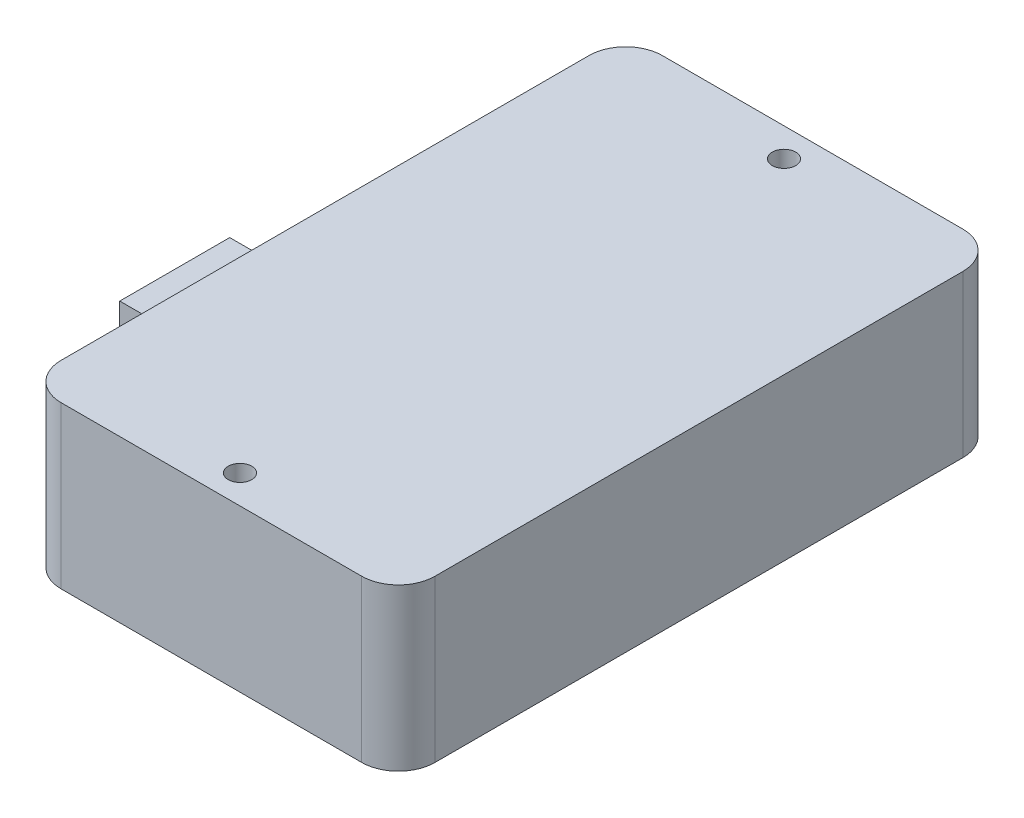
ISO-10303-21;
HEADER;
FILE_DESCRIPTION(('STEP AP214'),'2;1');
FILE_NAME('part.step','',(''),(''),'','','');
FILE_SCHEMA(('AUTOMOTIVE_DESIGN { 1 0 10303 214 1 1 1 1 }'));
ENDSEC;
DATA;
#1=APPLICATION_CONTEXT('core data for automotive mechanical design processes');
#2=APPLICATION_PROTOCOL_DEFINITION('international standard','automotive_design',2000,#1);
#3=PRODUCT_CONTEXT('',#1,'mechanical');
#4=PRODUCT('Part','Part','',(#3));
#5=PRODUCT_RELATED_PRODUCT_CATEGORY('part','',(#4));
#6=PRODUCT_DEFINITION_FORMATION('','',#4);
#7=PRODUCT_DEFINITION_CONTEXT('part definition',#1,'design');
#8=PRODUCT_DEFINITION('design','',#6,#7);
#9=PRODUCT_DEFINITION_SHAPE('','',#8);
#10=(LENGTH_UNIT() NAMED_UNIT(*) SI_UNIT(.MILLI.,.METRE.));
#11=(NAMED_UNIT(*) PLANE_ANGLE_UNIT() SI_UNIT($,.RADIAN.));
#12=(NAMED_UNIT(*) SI_UNIT($,.STERADIAN.) SOLID_ANGLE_UNIT());
#13=UNCERTAINTY_MEASURE_WITH_UNIT(LENGTH_MEASURE(1.E-05),#10,'distance_accuracy_value','');
#14=(GEOMETRIC_REPRESENTATION_CONTEXT(3) GLOBAL_UNCERTAINTY_ASSIGNED_CONTEXT((#13)) GLOBAL_UNIT_ASSIGNED_CONTEXT((#10,
#11,#12)) REPRESENTATION_CONTEXT('',''));
#15=CARTESIAN_POINT('',(0.,0.,0.));
#16=DIRECTION('',(0.,0.,1.));
#17=DIRECTION('',(1.,0.,0.));
#18=AXIS2_PLACEMENT_3D('',#15,#16,#17);
#19=CARTESIAN_POINT('',(0.,22.,41.));
#20=DIRECTION('',(0.,0.,-1.));
#21=DIRECTION('',(-1.,0.,0.));
#22=AXIS2_PLACEMENT_3D('',#19,#20,#21);
#23=PLANE('',#22);
#24=DIRECTION('',(1.,0.,0.));
#25=VECTOR('',#24,1.);
#26=CARTESIAN_POINT('',(0.,0.,41.));
#27=LINE('',#26,#25);
#28=CARTESIAN_POINT('',(-20.5,0.,41.));
#29=VERTEX_POINT('',#28);
#30=CARTESIAN_POINT('',(20.5,0.,41.));
#31=VERTEX_POINT('',#30);
#32=EDGE_CURVE('E150',#29,#31,#27,.T.);
#33=ORIENTED_EDGE('',*,*,#32,.T.);
#34=DIRECTION('',(0.,-1.,0.));
#35=VECTOR('',#34,1.);
#36=CARTESIAN_POINT('',(20.5,22.,41.));
#37=LINE('',#36,#35);
#38=CARTESIAN_POINT('',(20.5,22.,41.));
#39=VERTEX_POINT('',#38);
#40=EDGE_CURVE('E11',#31,#39,#37,.F.);
#41=ORIENTED_EDGE('',*,*,#40,.T.);
#42=DIRECTION('',(1.,0.,0.));
#43=VECTOR('',#42,1.);
#44=CARTESIAN_POINT('',(0.,22.,41.));
#45=LINE('',#44,#43);
#46=CARTESIAN_POINT('',(-20.5,22.,41.));
#47=VERTEX_POINT('',#46);
#48=EDGE_CURVE('E159',#47,#39,#45,.T.);
#49=ORIENTED_EDGE('',*,*,#48,.F.);
#50=DIRECTION('',(0.,-1.,0.));
#51=VECTOR('',#50,1.);
#52=CARTESIAN_POINT('',(-20.5,0.,41.));
#53=LINE('',#52,#51);
#54=EDGE_CURVE('E43',#47,#29,#53,.T.);
#55=ORIENTED_EDGE('',*,*,#54,.T.);
#56=EDGE_LOOP('',(#33,#41,#49,#55));
#57=FACE_BOUND('',#56,.T.);
#58=ADVANCED_FACE('F35',(#57),#23,.F.);
#59=CARTESIAN_POINT('',(25.5,22.,0.));
#60=DIRECTION('',(-1.,0.,0.));
#61=DIRECTION('',(0.,0.,1.));
#62=AXIS2_PLACEMENT_3D('',#59,#60,#61);
#63=PLANE('',#62);
#64=DIRECTION('',(0.,0.,-1.));
#65=VECTOR('',#64,1.);
#66=CARTESIAN_POINT('',(25.5,0.,0.));
#67=LINE('',#66,#65);
#68=CARTESIAN_POINT('',(25.5,0.,36.));
#69=VERTEX_POINT('',#68);
#70=CARTESIAN_POINT('',(25.5,0.,-36.));
#71=VERTEX_POINT('',#70);
#72=EDGE_CURVE('E153',#69,#71,#67,.T.);
#73=ORIENTED_EDGE('',*,*,#72,.T.);
#74=DIRECTION('',(0.,-1.,0.));
#75=VECTOR('',#74,1.);
#76=CARTESIAN_POINT('',(25.5,22.,-36.));
#77=LINE('',#76,#75);
#78=CARTESIAN_POINT('',(25.5,22.,-36.));
#79=VERTEX_POINT('',#78);
#80=EDGE_CURVE('E50',#71,#79,#77,.F.);
#81=ORIENTED_EDGE('',*,*,#80,.T.);
#82=DIRECTION('',(0.,0.,-1.));
#83=VECTOR('',#82,1.);
#84=CARTESIAN_POINT('',(25.5,22.,0.));
#85=LINE('',#84,#83);
#86=CARTESIAN_POINT('',(25.5,22.,36.));
#87=VERTEX_POINT('',#86);
#88=EDGE_CURVE('E161',#87,#79,#85,.T.);
#89=ORIENTED_EDGE('',*,*,#88,.F.);
#90=DIRECTION('',(0.,-1.,0.));
#91=VECTOR('',#90,1.);
#92=CARTESIAN_POINT('',(25.5,22.,36.));
#93=LINE('',#92,#91);
#94=EDGE_CURVE('E213',#87,#69,#93,.T.);
#95=ORIENTED_EDGE('',*,*,#94,.T.);
#96=EDGE_LOOP('',(#73,#81,#89,#95));
#97=FACE_BOUND('',#96,.T.);
#98=ADVANCED_FACE('F233',(#97),#63,.F.);
#99=CARTESIAN_POINT('',(0.,22.,-41.));
#100=DIRECTION('',(0.,0.,-1.));
#101=DIRECTION('',(-1.,0.,0.));
#102=AXIS2_PLACEMENT_3D('',#99,#100,#101);
#103=PLANE('',#102);
#104=DIRECTION('',(1.,0.,0.));
#105=VECTOR('',#104,1.);
#106=CARTESIAN_POINT('',(0.,0.,-41.));
#107=LINE('',#106,#105);
#108=CARTESIAN_POINT('',(-20.5,0.,-41.));
#109=VERTEX_POINT('',#108);
#110=CARTESIAN_POINT('',(20.5,0.,-41.));
#111=VERTEX_POINT('',#110);
#112=EDGE_CURVE('E178',#109,#111,#107,.T.);
#113=ORIENTED_EDGE('',*,*,#112,.F.);
#114=DIRECTION('',(0.,-1.,0.));
#115=VECTOR('',#114,1.);
#116=CARTESIAN_POINT('',(-20.5,22.,-41.));
#117=LINE('',#116,#115);
#118=CARTESIAN_POINT('',(-20.5,22.,-41.));
#119=VERTEX_POINT('',#118);
#120=EDGE_CURVE('E204',#109,#119,#117,.F.);
#121=ORIENTED_EDGE('',*,*,#120,.T.);
#122=DIRECTION('',(1.,0.,0.));
#123=VECTOR('',#122,1.);
#124=CARTESIAN_POINT('',(0.,22.,-41.));
#125=LINE('',#124,#123);
#126=CARTESIAN_POINT('',(20.5,22.,-41.));
#127=VERTEX_POINT('',#126);
#128=EDGE_CURVE('E164',#119,#127,#125,.T.);
#129=ORIENTED_EDGE('',*,*,#128,.T.);
#130=DIRECTION('',(0.,-1.,0.));
#131=VECTOR('',#130,1.);
#132=CARTESIAN_POINT('',(20.5,0.,-41.));
#133=LINE('',#132,#131);
#134=EDGE_CURVE('E201',#127,#111,#133,.T.);
#135=ORIENTED_EDGE('',*,*,#134,.T.);
#136=EDGE_LOOP('',(#113,#121,#129,#135));
#137=FACE_BOUND('',#136,.T.);
#138=ADVANCED_FACE('F243',(#137),#103,.T.);
#139=CARTESIAN_POINT('',(0.,22.,37.1));
#140=DIRECTION('',(0.,-1.,0.));
#141=DIRECTION('',(0.,0.,-1.));
#142=AXIS2_PLACEMENT_3D('',#139,#140,#141);
#143=CYLINDRICAL_SURFACE('',#142,1.6);
#144=CARTESIAN_POINT('',(0.,22.,37.1));
#145=DIRECTION('',(0.,1.,0.));
#146=DIRECTION('',(0.,0.,1.));
#147=AXIS2_PLACEMENT_3D('',#144,#145,#146);
#148=CIRCLE('',#147,1.6);
#149=CARTESIAN_POINT('',(0.,22.,38.7));
#150=VERTEX_POINT('',#149);
#151=EDGE_CURVE('E170',#150,#150,#148,.T.);
#152=ORIENTED_EDGE('',*,*,#151,.T.);
#153=EDGE_LOOP('',(#152));
#154=FACE_BOUND('',#153,.T.);
#155=CARTESIAN_POINT('',(0.,0.,37.1));
#156=DIRECTION('',(0.,1.,0.));
#157=DIRECTION('',(0.,0.,1.));
#158=AXIS2_PLACEMENT_3D('',#155,#156,#157);
#159=CIRCLE('',#158,1.6);
#160=CARTESIAN_POINT('',(0.,0.,38.7));
#161=VERTEX_POINT('',#160);
#162=EDGE_CURVE('E184',#161,#161,#159,.T.);
#163=ORIENTED_EDGE('',*,*,#162,.F.);
#164=EDGE_LOOP('',(#163));
#165=FACE_BOUND('',#164,.T.);
#166=ADVANCED_FACE('F349',(#154,#165),#143,.F.);
#167=CARTESIAN_POINT('',(-25.5,22.,0.));
#168=DIRECTION('',(-1.,0.,0.));
#169=DIRECTION('',(0.,0.,1.));
#170=AXIS2_PLACEMENT_3D('',#167,#168,#169);
#171=PLANE('',#170);
#172=DIRECTION('',(0.,0.,-1.));
#173=VECTOR('',#172,1.);
#174=CARTESIAN_POINT('',(-25.5,22.,0.));
#175=LINE('',#174,#173);
#176=CARTESIAN_POINT('',(-25.5,22.,36.));
#177=VERTEX_POINT('',#176);
#178=CARTESIAN_POINT('',(-25.5,22.,-36.));
#179=VERTEX_POINT('',#178);
#180=EDGE_CURVE('E167',#177,#179,#175,.T.);
#181=ORIENTED_EDGE('',*,*,#180,.T.);
#182=DIRECTION('',(0.,-1.,0.));
#183=VECTOR('',#182,1.);
#184=CARTESIAN_POINT('',(-25.5,22.,-36.));
#185=LINE('',#184,#183);
#186=CARTESIAN_POINT('',(-25.5,0.,-36.));
#187=VERTEX_POINT('',#186);
#188=EDGE_CURVE('E190',#179,#187,#185,.T.);
#189=ORIENTED_EDGE('',*,*,#188,.T.);
#190=DIRECTION('',(0.,0.,-1.));
#191=VECTOR('',#190,1.);
#192=CARTESIAN_POINT('',(-25.5,0.,0.));
#193=LINE('',#192,#191);
#194=CARTESIAN_POINT('',(-25.5,0.,3.));
#195=VERTEX_POINT('',#194);
#196=EDGE_CURVE('E181',#195,#187,#193,.T.);
#197=ORIENTED_EDGE('',*,*,#196,.F.);
#198=DIRECTION('',(0.,-1.,0.));
#199=VECTOR('',#198,1.);
#200=CARTESIAN_POINT('',(-25.5,15.,3.));
#201=LINE('',#200,#199);
#202=CARTESIAN_POINT('',(-25.5,15.,3.));
#203=VERTEX_POINT('',#202);
#204=EDGE_CURVE('E408',#203,#195,#201,.T.);
#205=ORIENTED_EDGE('',*,*,#204,.F.);
#206=DIRECTION('',(0.,0.,-1.));
#207=VECTOR('',#206,1.);
#208=CARTESIAN_POINT('',(-25.5,15.,0.));
#209=LINE('',#208,#207);
#210=CARTESIAN_POINT('',(-25.5,15.,18.));
#211=VERTEX_POINT('',#210);
#212=EDGE_CURVE('E142',#211,#203,#209,.T.);
#213=ORIENTED_EDGE('',*,*,#212,.F.);
#214=DIRECTION('',(0.,-1.,0.));
#215=VECTOR('',#214,1.);
#216=CARTESIAN_POINT('',(-25.5,15.,18.));
#217=LINE('',#216,#215);
#218=CARTESIAN_POINT('',(-25.5,0.,18.));
#219=VERTEX_POINT('',#218);
#220=EDGE_CURVE('E155',#211,#219,#217,.T.);
#221=ORIENTED_EDGE('',*,*,#220,.T.);
#222=CARTESIAN_POINT('',(-25.5,0.,36.));
#223=VERTEX_POINT('',#222);
#224=EDGE_CURVE('E182',#223,#219,#193,.T.);
#225=ORIENTED_EDGE('',*,*,#224,.F.);
#226=DIRECTION('',(0.,-1.,0.));
#227=VECTOR('',#226,1.);
#228=CARTESIAN_POINT('',(-25.5,22.,36.));
#229=LINE('',#228,#227);
#230=EDGE_CURVE('E175',#223,#177,#229,.F.);
#231=ORIENTED_EDGE('',*,*,#230,.T.);
#232=EDGE_LOOP('',(#181,#189,#197,#205,#213,#221,#225,#231));
#233=FACE_BOUND('',#232,.T.);
#234=ADVANCED_FACE('F251',(#233),#171,.T.);
#235=CARTESIAN_POINT('',(0.,22.,-37.1));
#236=DIRECTION('',(0.,-1.,0.));
#237=DIRECTION('',(0.,0.,-1.));
#238=AXIS2_PLACEMENT_3D('',#235,#236,#237);
#239=CYLINDRICAL_SURFACE('',#238,1.6);
#240=CARTESIAN_POINT('',(0.,22.,-37.1));
#241=DIRECTION('',(0.,1.,0.));
#242=DIRECTION('',(0.,0.,1.));
#243=AXIS2_PLACEMENT_3D('',#240,#241,#242);
#244=CIRCLE('',#243,1.6);
#245=CARTESIAN_POINT('',(0.,22.,-35.5));
#246=VERTEX_POINT('',#245);
#247=EDGE_CURVE('E173',#246,#246,#244,.F.);
#248=ORIENTED_EDGE('',*,*,#247,.F.);
#249=EDGE_LOOP('',(#248));
#250=FACE_BOUND('',#249,.T.);
#251=CARTESIAN_POINT('',(0.,0.,-37.1));
#252=DIRECTION('',(0.,1.,0.));
#253=DIRECTION('',(0.,0.,1.));
#254=AXIS2_PLACEMENT_3D('',#251,#252,#253);
#255=CIRCLE('',#254,1.6);
#256=CARTESIAN_POINT('',(0.,0.,-35.5));
#257=VERTEX_POINT('',#256);
#258=EDGE_CURVE('E162',#257,#257,#255,.F.);
#259=ORIENTED_EDGE('',*,*,#258,.T.);
#260=EDGE_LOOP('',(#259));
#261=FACE_BOUND('',#260,.T.);
#262=ADVANCED_FACE('F338',(#250,#261),#239,.F.);
#263=CARTESIAN_POINT('',(0.,22.,0.));
#264=DIRECTION('',(0.,1.,0.));
#265=DIRECTION('',(0.,0.,1.));
#266=AXIS2_PLACEMENT_3D('',#263,#264,#265);
#267=PLANE('',#266);
#268=ORIENTED_EDGE('',*,*,#128,.F.);
#269=CARTESIAN_POINT('',(-20.5,22.,-36.));
#270=DIRECTION('',(0.,1.,0.));
#271=DIRECTION('',(0.,0.,1.));
#272=AXIS2_PLACEMENT_3D('',#269,#270,#271);
#273=CIRCLE('',#272,5.);
#274=EDGE_CURVE('E211',#119,#179,#273,.T.);
#275=ORIENTED_EDGE('',*,*,#274,.T.);
#276=ORIENTED_EDGE('',*,*,#180,.F.);
#277=CARTESIAN_POINT('',(-20.5,22.,36.));
#278=DIRECTION('',(0.,1.,0.));
#279=DIRECTION('',(0.,0.,1.));
#280=AXIS2_PLACEMENT_3D('',#277,#278,#279);
#281=CIRCLE('',#280,5.);
#282=EDGE_CURVE('E206',#177,#47,#281,.T.);
#283=ORIENTED_EDGE('',*,*,#282,.T.);
#284=ORIENTED_EDGE('',*,*,#48,.T.);
#285=CARTESIAN_POINT('',(20.5,22.,36.));
#286=DIRECTION('',(0.,1.,0.));
#287=DIRECTION('',(0.,0.,1.));
#288=AXIS2_PLACEMENT_3D('',#285,#286,#287);
#289=CIRCLE('',#288,5.);
#290=EDGE_CURVE('E57',#39,#87,#289,.T.);
#291=ORIENTED_EDGE('',*,*,#290,.T.);
#292=ORIENTED_EDGE('',*,*,#88,.T.);
#293=CARTESIAN_POINT('',(20.5,22.,-36.));
#294=DIRECTION('',(0.,1.,0.));
#295=DIRECTION('',(0.,0.,1.));
#296=AXIS2_PLACEMENT_3D('',#293,#294,#295);
#297=CIRCLE('',#296,5.);
#298=EDGE_CURVE('E209',#79,#127,#297,.T.);
#299=ORIENTED_EDGE('',*,*,#298,.T.);
#300=EDGE_LOOP('',(#268,#275,#276,#283,#284,#291,#292,#299));
#301=FACE_BOUND('',#300,.T.);
#302=ORIENTED_EDGE('',*,*,#151,.F.);
#303=EDGE_LOOP('',(#302));
#304=FACE_BOUND('',#303,.T.);
#305=ORIENTED_EDGE('',*,*,#247,.T.);
#306=EDGE_LOOP('',(#305));
#307=FACE_BOUND('',#306,.T.);
#308=ADVANCED_FACE('F236',(#301,#304,#307),#267,.T.);
#309=CARTESIAN_POINT('',(0.,0.,0.));
#310=DIRECTION('',(0.,1.,0.));
#311=DIRECTION('',(0.,0.,1.));
#312=AXIS2_PLACEMENT_3D('',#309,#310,#311);
#313=PLANE('',#312);
#314=ORIENTED_EDGE('',*,*,#196,.T.);
#315=CARTESIAN_POINT('',(-20.5,0.,-36.));
#316=DIRECTION('',(0.,1.,0.));
#317=DIRECTION('',(0.,0.,1.));
#318=AXIS2_PLACEMENT_3D('',#315,#316,#317);
#319=CIRCLE('',#318,5.);
#320=EDGE_CURVE('E199',#187,#109,#319,.F.);
#321=ORIENTED_EDGE('',*,*,#320,.T.);
#322=ORIENTED_EDGE('',*,*,#112,.T.);
#323=CARTESIAN_POINT('',(20.5,0.,-36.));
#324=DIRECTION('',(0.,1.,0.));
#325=DIRECTION('',(0.,0.,1.));
#326=AXIS2_PLACEMENT_3D('',#323,#324,#325);
#327=CIRCLE('',#326,5.);
#328=EDGE_CURVE('E197',#111,#71,#327,.F.);
#329=ORIENTED_EDGE('',*,*,#328,.T.);
#330=ORIENTED_EDGE('',*,*,#72,.F.);
#331=CARTESIAN_POINT('',(20.5,0.,36.));
#332=DIRECTION('',(0.,1.,0.));
#333=DIRECTION('',(0.,0.,1.));
#334=AXIS2_PLACEMENT_3D('',#331,#332,#333);
#335=CIRCLE('',#334,5.);
#336=EDGE_CURVE('E195',#69,#31,#335,.F.);
#337=ORIENTED_EDGE('',*,*,#336,.T.);
#338=ORIENTED_EDGE('',*,*,#32,.F.);
#339=CARTESIAN_POINT('',(-20.5,0.,36.));
#340=DIRECTION('',(0.,1.,0.));
#341=DIRECTION('',(0.,0.,1.));
#342=AXIS2_PLACEMENT_3D('',#339,#340,#341);
#343=CIRCLE('',#342,5.);
#344=EDGE_CURVE('E193',#29,#223,#343,.F.);
#345=ORIENTED_EDGE('',*,*,#344,.T.);
#346=ORIENTED_EDGE('',*,*,#224,.T.);
#347=DIRECTION('',(-1.,0.,0.));
#348=VECTOR('',#347,1.);
#349=CARTESIAN_POINT('',(0.,0.,18.));
#350=LINE('',#349,#348);
#351=CARTESIAN_POINT('',(-35.5,0.,18.));
#352=VERTEX_POINT('',#351);
#353=EDGE_CURVE('E145',#219,#352,#350,.T.);
#354=ORIENTED_EDGE('',*,*,#353,.T.);
#355=DIRECTION('',(0.,0.,1.));
#356=VECTOR('',#355,1.);
#357=CARTESIAN_POINT('',(-35.5,0.,0.));
#358=LINE('',#357,#356);
#359=CARTESIAN_POINT('',(-35.5,0.,3.));
#360=VERTEX_POINT('',#359);
#361=EDGE_CURVE('E406',#360,#352,#358,.T.);
#362=ORIENTED_EDGE('',*,*,#361,.F.);
#363=DIRECTION('',(-1.,0.,0.));
#364=VECTOR('',#363,1.);
#365=CARTESIAN_POINT('',(0.,0.,3.));
#366=LINE('',#365,#364);
#367=EDGE_CURVE('E149',#195,#360,#366,.T.);
#368=ORIENTED_EDGE('',*,*,#367,.F.);
#369=EDGE_LOOP('',(#314,#321,#322,#329,#330,#337,#338,#345,#346,#354,#362,#368));
#370=FACE_BOUND('',#369,.T.);
#371=ORIENTED_EDGE('',*,*,#162,.T.);
#372=EDGE_LOOP('',(#371));
#373=FACE_BOUND('',#372,.T.);
#374=ORIENTED_EDGE('',*,*,#258,.F.);
#375=EDGE_LOOP('',(#374));
#376=FACE_BOUND('',#375,.T.);
#377=ADVANCED_FACE('F226',(#370,#373,#376),#313,.F.);
#378=CARTESIAN_POINT('',(0.,15.,3.));
#379=DIRECTION('',(0.,0.,1.));
#380=DIRECTION('',(1.,0.,0.));
#381=AXIS2_PLACEMENT_3D('',#378,#379,#380);
#382=PLANE('',#381);
#383=ORIENTED_EDGE('',*,*,#367,.T.);
#384=DIRECTION('',(0.,-1.,0.));
#385=VECTOR('',#384,1.);
#386=CARTESIAN_POINT('',(-35.5,15.,3.));
#387=LINE('',#386,#385);
#388=CARTESIAN_POINT('',(-35.5,15.,3.));
#389=VERTEX_POINT('',#388);
#390=EDGE_CURVE('E130',#389,#360,#387,.T.);
#391=ORIENTED_EDGE('',*,*,#390,.F.);
#392=DIRECTION('',(-1.,0.,0.));
#393=VECTOR('',#392,1.);
#394=CARTESIAN_POINT('',(0.,15.,3.));
#395=LINE('',#394,#393);
#396=EDGE_CURVE('E137',#203,#389,#395,.T.);
#397=ORIENTED_EDGE('',*,*,#396,.F.);
#398=ORIENTED_EDGE('',*,*,#204,.T.);
#399=EDGE_LOOP('',(#383,#391,#397,#398));
#400=FACE_BOUND('',#399,.T.);
#401=ADVANCED_FACE('F147',(#400),#382,.F.);
#402=CARTESIAN_POINT('',(-35.5,15.,0.));
#403=DIRECTION('',(1.,0.,0.));
#404=DIRECTION('',(0.,0.,-1.));
#405=AXIS2_PLACEMENT_3D('',#402,#403,#404);
#406=PLANE('',#405);
#407=ORIENTED_EDGE('',*,*,#361,.T.);
#408=DIRECTION('',(0.,-1.,0.));
#409=VECTOR('',#408,1.);
#410=CARTESIAN_POINT('',(-35.5,15.,18.));
#411=LINE('',#410,#409);
#412=CARTESIAN_POINT('',(-35.5,15.,18.));
#413=VERTEX_POINT('',#412);
#414=EDGE_CURVE('E132',#413,#352,#411,.T.);
#415=ORIENTED_EDGE('',*,*,#414,.F.);
#416=DIRECTION('',(0.,0.,1.));
#417=VECTOR('',#416,1.);
#418=CARTESIAN_POINT('',(-35.5,15.,0.));
#419=LINE('',#418,#417);
#420=EDGE_CURVE('E125',#389,#413,#419,.T.);
#421=ORIENTED_EDGE('',*,*,#420,.F.);
#422=ORIENTED_EDGE('',*,*,#390,.T.);
#423=EDGE_LOOP('',(#407,#415,#421,#422));
#424=FACE_BOUND('',#423,.T.);
#425=ADVANCED_FACE('F128',(#424),#406,.F.);
#426=CARTESIAN_POINT('',(0.,15.,18.));
#427=DIRECTION('',(0.,0.,1.));
#428=DIRECTION('',(1.,0.,0.));
#429=AXIS2_PLACEMENT_3D('',#426,#427,#428);
#430=PLANE('',#429);
#431=ORIENTED_EDGE('',*,*,#353,.F.);
#432=ORIENTED_EDGE('',*,*,#220,.F.);
#433=DIRECTION('',(-1.,0.,0.));
#434=VECTOR('',#433,1.);
#435=CARTESIAN_POINT('',(0.,15.,18.));
#436=LINE('',#435,#434);
#437=EDGE_CURVE('E136',#211,#413,#436,.T.);
#438=ORIENTED_EDGE('',*,*,#437,.T.);
#439=ORIENTED_EDGE('',*,*,#414,.T.);
#440=EDGE_LOOP('',(#431,#432,#438,#439));
#441=FACE_BOUND('',#440,.T.);
#442=ADVANCED_FACE('F298',(#441),#430,.T.);
#443=CARTESIAN_POINT('',(0.,15.,0.));
#444=DIRECTION('',(0.,1.,0.));
#445=DIRECTION('',(0.,0.,1.));
#446=AXIS2_PLACEMENT_3D('',#443,#444,#445);
#447=PLANE('',#446);
#448=ORIENTED_EDGE('',*,*,#396,.T.);
#449=ORIENTED_EDGE('',*,*,#420,.T.);
#450=ORIENTED_EDGE('',*,*,#437,.F.);
#451=ORIENTED_EDGE('',*,*,#212,.T.);
#452=EDGE_LOOP('',(#448,#449,#450,#451));
#453=FACE_BOUND('',#452,.T.);
#454=ADVANCED_FACE('F140',(#453),#447,.T.);
#455=CARTESIAN_POINT('',(-20.5,22.,-36.));
#456=DIRECTION('',(0.,-1.,0.));
#457=DIRECTION('',(0.,0.,-1.));
#458=AXIS2_PLACEMENT_3D('',#455,#456,#457);
#459=CYLINDRICAL_SURFACE('',#458,5.);
#460=ORIENTED_EDGE('',*,*,#274,.F.);
#461=ORIENTED_EDGE('',*,*,#120,.F.);
#462=ORIENTED_EDGE('',*,*,#320,.F.);
#463=ORIENTED_EDGE('',*,*,#188,.F.);
#464=EDGE_LOOP('',(#460,#461,#462,#463));
#465=FACE_BOUND('',#464,.T.);
#466=ADVANCED_FACE('F249',(#465),#459,.T.);
#467=CARTESIAN_POINT('',(20.5,22.,-36.));
#468=DIRECTION('',(0.,1.,0.));
#469=DIRECTION('',(0.,0.,1.));
#470=AXIS2_PLACEMENT_3D('',#467,#468,#469);
#471=CYLINDRICAL_SURFACE('',#470,5.);
#472=ORIENTED_EDGE('',*,*,#298,.F.);
#473=ORIENTED_EDGE('',*,*,#80,.F.);
#474=ORIENTED_EDGE('',*,*,#328,.F.);
#475=ORIENTED_EDGE('',*,*,#134,.F.);
#476=EDGE_LOOP('',(#472,#473,#474,#475));
#477=FACE_BOUND('',#476,.T.);
#478=ADVANCED_FACE('F240',(#477),#471,.T.);
#479=CARTESIAN_POINT('',(20.5,22.,36.));
#480=DIRECTION('',(0.,-1.,0.));
#481=DIRECTION('',(0.,0.,-1.));
#482=AXIS2_PLACEMENT_3D('',#479,#480,#481);
#483=CYLINDRICAL_SURFACE('',#482,5.);
#484=ORIENTED_EDGE('',*,*,#290,.F.);
#485=ORIENTED_EDGE('',*,*,#40,.F.);
#486=ORIENTED_EDGE('',*,*,#336,.F.);
#487=ORIENTED_EDGE('',*,*,#94,.F.);
#488=EDGE_LOOP('',(#484,#485,#486,#487));
#489=FACE_BOUND('',#488,.T.);
#490=ADVANCED_FACE('F232',(#489),#483,.T.);
#491=CARTESIAN_POINT('',(-20.5,22.,36.));
#492=DIRECTION('',(0.,1.,0.));
#493=DIRECTION('',(0.,0.,1.));
#494=AXIS2_PLACEMENT_3D('',#491,#492,#493);
#495=CYLINDRICAL_SURFACE('',#494,5.);
#496=ORIENTED_EDGE('',*,*,#282,.F.);
#497=ORIENTED_EDGE('',*,*,#230,.F.);
#498=ORIENTED_EDGE('',*,*,#344,.F.);
#499=ORIENTED_EDGE('',*,*,#54,.F.);
#500=EDGE_LOOP('',(#496,#497,#498,#499));
#501=FACE_BOUND('',#500,.T.);
#502=ADVANCED_FACE('F37',(#501),#495,.T.);
#503=CLOSED_SHELL('',(#58,#98,#138,#166,#234,#262,#308,#377,#401,#425,#442,#454,#466,#478,#490,#502));
#504=MANIFOLD_SOLID_BREP('B2',#503);
#505=ADVANCED_BREP_SHAPE_REPRESENTATION('',(#18,#504),#14);
#506=SHAPE_DEFINITION_REPRESENTATION(#9,#505);
ENDSEC;
END-ISO-10303-21;
